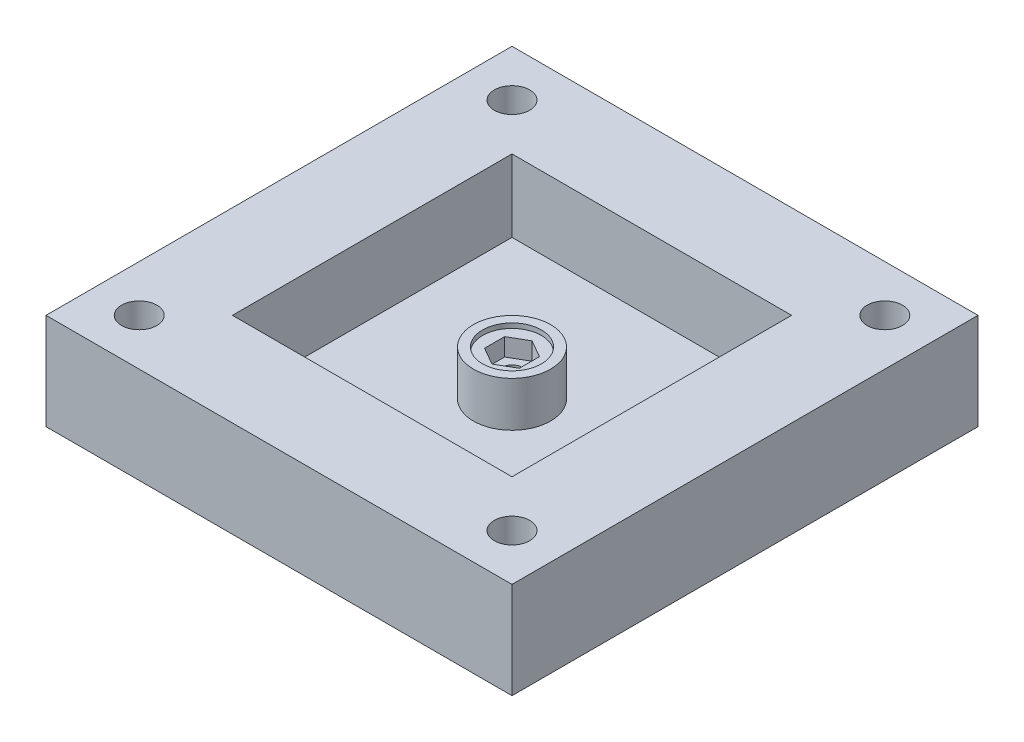
ISO-10303-21;
HEADER;
FILE_DESCRIPTION(('STEP AP214'),'2;1');
FILE_NAME('part.step','',(''),(''),'','','');
FILE_SCHEMA(('AUTOMOTIVE_DESIGN { 1 0 10303 214 1 1 1 1 }'));
ENDSEC;
DATA;
#1=APPLICATION_CONTEXT('core data for automotive mechanical design processes');
#2=APPLICATION_PROTOCOL_DEFINITION('international standard','automotive_design',2000,#1);
#3=PRODUCT_CONTEXT('',#1,'mechanical');
#4=PRODUCT('Part','Part','',(#3));
#5=PRODUCT_RELATED_PRODUCT_CATEGORY('part','',(#4));
#6=PRODUCT_DEFINITION_FORMATION('','',#4);
#7=PRODUCT_DEFINITION_CONTEXT('part definition',#1,'design');
#8=PRODUCT_DEFINITION('design','',#6,#7);
#9=PRODUCT_DEFINITION_SHAPE('','',#8);
#10=(LENGTH_UNIT() NAMED_UNIT(*) SI_UNIT(.MILLI.,.METRE.));
#11=(NAMED_UNIT(*) PLANE_ANGLE_UNIT() SI_UNIT($,.RADIAN.));
#12=(NAMED_UNIT(*) SI_UNIT($,.STERADIAN.) SOLID_ANGLE_UNIT());
#13=UNCERTAINTY_MEASURE_WITH_UNIT(LENGTH_MEASURE(1.E-05),#10,'distance_accuracy_value','');
#14=(GEOMETRIC_REPRESENTATION_CONTEXT(3) GLOBAL_UNCERTAINTY_ASSIGNED_CONTEXT((#13)) GLOBAL_UNIT_ASSIGNED_CONTEXT((#10,
#11,#12)) REPRESENTATION_CONTEXT('',''));
#15=CARTESIAN_POINT('',(0.,0.,0.));
#16=DIRECTION('',(0.,0.,1.));
#17=DIRECTION('',(1.,0.,0.));
#18=AXIS2_PLACEMENT_3D('',#15,#16,#17);
#19=CARTESIAN_POINT('',(5.4126587736527,14.5,-3.12500000000006));
#20=DIRECTION('',(0.499999999999995,0.,-0.866025403784441));
#21=DIRECTION('',(-0.866025403784442,0.,-0.499999999999995));
#22=AXIS2_PLACEMENT_3D('',#19,#20,#21);
#23=PLANE('',#22);
#24=DIRECTION('',(0.866025403784442,0.,0.499999999999995));
#25=VECTOR('',#24,1.);
#26=CARTESIAN_POINT('',(5.4126587736527,20.,-3.12500000000006));
#27=LINE('',#26,#25);
#28=CARTESIAN_POINT('',(0.,20.,-6.25));
#29=VERTEX_POINT('',#28);
#30=CARTESIAN_POINT('',(5.4126587736527,20.,-3.12500000000006));
#31=VERTEX_POINT('',#30);
#32=EDGE_CURVE('E145',#29,#31,#27,.T.);
#33=ORIENTED_EDGE('',*,*,#32,.F.);
#34=DIRECTION('',(0.,1.,0.));
#35=VECTOR('',#34,1.);
#36=CARTESIAN_POINT('',(0.,14.5,-6.25));
#37=LINE('',#36,#35);
#38=CARTESIAN_POINT('',(0.,14.5,-6.25));
#39=VERTEX_POINT('',#38);
#40=EDGE_CURVE('E153',#39,#29,#37,.T.);
#41=ORIENTED_EDGE('',*,*,#40,.F.);
#42=DIRECTION('',(-0.866025403784442,0.,-0.499999999999995));
#43=VECTOR('',#42,1.);
#44=CARTESIAN_POINT('',(5.4126587736527,14.5,-3.12500000000006));
#45=LINE('',#44,#43);
#46=CARTESIAN_POINT('',(5.4126587736527,14.5,-3.12500000000006));
#47=VERTEX_POINT('',#46);
#48=EDGE_CURVE('E524',#47,#39,#45,.T.);
#49=ORIENTED_EDGE('',*,*,#48,.F.);
#50=DIRECTION('',(0.,1.,0.));
#51=VECTOR('',#50,1.);
#52=CARTESIAN_POINT('',(5.4126587736527,14.5,-3.12500000000006));
#53=LINE('',#52,#51);
#54=EDGE_CURVE('E155',#47,#31,#53,.T.);
#55=ORIENTED_EDGE('',*,*,#54,.T.);
#56=EDGE_LOOP('',(#33,#41,#49,#55));
#57=FACE_BOUND('',#56,.T.);
#58=ADVANCED_FACE('F45',(#57),#23,.F.);
#59=CARTESIAN_POINT('',(5.41265877365277,14.5,3.12499999999995));
#60=DIRECTION('',(1.,0.,0.));
#61=DIRECTION('',(0.,0.,-1.));
#62=AXIS2_PLACEMENT_3D('',#59,#60,#61);
#63=PLANE('',#62);
#64=DIRECTION('',(0.,0.,1.));
#65=VECTOR('',#64,1.);
#66=CARTESIAN_POINT('',(5.41265877365277,20.,3.12499999999995));
#67=LINE('',#66,#65);
#68=CARTESIAN_POINT('',(5.41265877365277,20.,3.12499999999995));
#69=VERTEX_POINT('',#68);
#70=EDGE_CURVE('E158',#31,#69,#67,.T.);
#71=ORIENTED_EDGE('',*,*,#70,.F.);
#72=ORIENTED_EDGE('',*,*,#54,.F.);
#73=DIRECTION('',(0.,0.,-1.));
#74=VECTOR('',#73,1.);
#75=CARTESIAN_POINT('',(5.41265877365277,14.5,3.12499999999995));
#76=LINE('',#75,#74);
#77=CARTESIAN_POINT('',(5.41265877365277,14.5,3.12499999999995));
#78=VERTEX_POINT('',#77);
#79=EDGE_CURVE('E166',#78,#47,#76,.T.);
#80=ORIENTED_EDGE('',*,*,#79,.F.);
#81=DIRECTION('',(0.,1.,0.));
#82=VECTOR('',#81,1.);
#83=CARTESIAN_POINT('',(5.41265877365277,14.5,3.12499999999995));
#84=LINE('',#83,#82);
#85=EDGE_CURVE('E550',#78,#69,#84,.T.);
#86=ORIENTED_EDGE('',*,*,#85,.T.);
#87=EDGE_LOOP('',(#71,#72,#80,#86));
#88=FACE_BOUND('',#87,.T.);
#89=ADVANCED_FACE('F325',(#88),#63,.F.);
#90=CARTESIAN_POINT('',(0.,14.5,6.25));
#91=DIRECTION('',(0.500000000000007,0.,0.866025403784435));
#92=DIRECTION('',(0.866025403784435,0.,-0.500000000000007));
#93=AXIS2_PLACEMENT_3D('',#90,#91,#92);
#94=PLANE('',#93);
#95=DIRECTION('',(-0.866025403784435,0.,0.500000000000007));
#96=VECTOR('',#95,1.);
#97=CARTESIAN_POINT('',(0.,20.,6.25));
#98=LINE('',#97,#96);
#99=CARTESIAN_POINT('',(0.,20.,6.25));
#100=VERTEX_POINT('',#99);
#101=EDGE_CURVE('E568',#69,#100,#98,.T.);
#102=ORIENTED_EDGE('',*,*,#101,.F.);
#103=ORIENTED_EDGE('',*,*,#85,.F.);
#104=DIRECTION('',(0.866025403784435,0.,-0.500000000000007));
#105=VECTOR('',#104,1.);
#106=CARTESIAN_POINT('',(0.,14.5,6.25));
#107=LINE('',#106,#105);
#108=CARTESIAN_POINT('',(0.,14.5,6.25));
#109=VERTEX_POINT('',#108);
#110=EDGE_CURVE('E173',#109,#78,#107,.T.);
#111=ORIENTED_EDGE('',*,*,#110,.F.);
#112=DIRECTION('',(0.,1.,0.));
#113=VECTOR('',#112,1.);
#114=CARTESIAN_POINT('',(0.,14.5,6.25));
#115=LINE('',#114,#113);
#116=EDGE_CURVE('E554',#109,#100,#115,.T.);
#117=ORIENTED_EDGE('',*,*,#116,.T.);
#118=EDGE_LOOP('',(#102,#103,#111,#117));
#119=FACE_BOUND('',#118,.T.);
#120=ADVANCED_FACE('F331',(#119),#94,.F.);
#121=CARTESIAN_POINT('',(-5.41265877365273,14.5,3.12500000000002));
#122=DIRECTION('',(-0.499999999999995,0.,0.866025403784441));
#123=DIRECTION('',(0.866025403784442,0.,0.499999999999995));
#124=AXIS2_PLACEMENT_3D('',#121,#122,#123);
#125=PLANE('',#124);
#126=DIRECTION('',(-0.866025403784442,0.,-0.499999999999995));
#127=VECTOR('',#126,1.);
#128=CARTESIAN_POINT('',(-5.41265877365273,20.,3.12500000000002));
#129=LINE('',#128,#127);
#130=CARTESIAN_POINT('',(-5.41265877365273,20.,3.12500000000003));
#131=VERTEX_POINT('',#130);
#132=EDGE_CURVE('E561',#100,#131,#129,.T.);
#133=ORIENTED_EDGE('',*,*,#132,.F.);
#134=ORIENTED_EDGE('',*,*,#116,.F.);
#135=DIRECTION('',(0.866025403784441,0.,0.499999999999995));
#136=VECTOR('',#135,1.);
#137=CARTESIAN_POINT('',(-5.41265877365273,14.5,3.12500000000002));
#138=LINE('',#137,#136);
#139=CARTESIAN_POINT('',(-5.41265877365273,14.5,3.12500000000002));
#140=VERTEX_POINT('',#139);
#141=EDGE_CURVE('E542',#140,#109,#138,.T.);
#142=ORIENTED_EDGE('',*,*,#141,.F.);
#143=DIRECTION('',(0.,1.,0.));
#144=VECTOR('',#143,1.);
#145=CARTESIAN_POINT('',(-5.41265877365273,14.5,3.12500000000002));
#146=LINE('',#145,#144);
#147=EDGE_CURVE('E170',#140,#131,#146,.T.);
#148=ORIENTED_EDGE('',*,*,#147,.T.);
#149=EDGE_LOOP('',(#133,#134,#142,#148));
#150=FACE_BOUND('',#149,.T.);
#151=ADVANCED_FACE('F469',(#150),#125,.F.);
#152=CARTESIAN_POINT('',(-5.41265877365275,14.5,-3.12499999999999));
#153=DIRECTION('',(-1.,0.,0.));
#154=DIRECTION('',(0.,0.,1.));
#155=AXIS2_PLACEMENT_3D('',#152,#153,#154);
#156=PLANE('',#155);
#157=DIRECTION('',(0.,0.,-1.));
#158=VECTOR('',#157,1.);
#159=CARTESIAN_POINT('',(-5.41265877365275,20.,-3.12499999999999));
#160=LINE('',#159,#158);
#161=CARTESIAN_POINT('',(-5.41265877365275,20.,-3.12499999999999));
#162=VERTEX_POINT('',#161);
#163=EDGE_CURVE('E60',#131,#162,#160,.T.);
#164=ORIENTED_EDGE('',*,*,#163,.F.);
#165=ORIENTED_EDGE('',*,*,#147,.F.);
#166=DIRECTION('',(0.,0.,1.));
#167=VECTOR('',#166,1.);
#168=CARTESIAN_POINT('',(-5.41265877365275,14.5,-3.12499999999999));
#169=LINE('',#168,#167);
#170=CARTESIAN_POINT('',(-5.41265877365275,14.5,-3.12499999999999));
#171=VERTEX_POINT('',#170);
#172=EDGE_CURVE('E533',#171,#140,#169,.T.);
#173=ORIENTED_EDGE('',*,*,#172,.F.);
#174=DIRECTION('',(0.,1.,0.));
#175=VECTOR('',#174,1.);
#176=CARTESIAN_POINT('',(-5.41265877365275,14.5,-3.12499999999999));
#177=LINE('',#176,#175);
#178=EDGE_CURVE('E165',#171,#162,#177,.T.);
#179=ORIENTED_EDGE('',*,*,#178,.T.);
#180=EDGE_LOOP('',(#164,#165,#173,#179));
#181=FACE_BOUND('',#180,.T.);
#182=ADVANCED_FACE('F462',(#181),#156,.F.);
#183=CARTESIAN_POINT('',(0.,14.5,-6.25));
#184=DIRECTION('',(-0.500000000000001,0.,-0.866025403784438));
#185=DIRECTION('',(-0.866025403784438,0.,0.500000000000001));
#186=AXIS2_PLACEMENT_3D('',#183,#184,#185);
#187=PLANE('',#186);
#188=DIRECTION('',(0.866025403784438,0.,-0.500000000000001));
#189=VECTOR('',#188,1.);
#190=CARTESIAN_POINT('',(0.,20.,-6.25));
#191=LINE('',#190,#189);
#192=EDGE_CURVE('E11',#162,#29,#191,.T.);
#193=ORIENTED_EDGE('',*,*,#192,.F.);
#194=ORIENTED_EDGE('',*,*,#178,.F.);
#195=DIRECTION('',(-0.866025403784438,0.,0.500000000000001));
#196=VECTOR('',#195,1.);
#197=CARTESIAN_POINT('',(0.,14.5,-6.25));
#198=LINE('',#197,#196);
#199=EDGE_CURVE('E162',#39,#171,#198,.T.);
#200=ORIENTED_EDGE('',*,*,#199,.F.);
#201=ORIENTED_EDGE('',*,*,#40,.T.);
#202=EDGE_LOOP('',(#193,#194,#200,#201));
#203=FACE_BOUND('',#202,.T.);
#204=ADVANCED_FACE('F160',(#203),#187,.F.);
#205=CARTESIAN_POINT('',(72.5,30.,72.5));
#206=DIRECTION('',(-1.,0.,0.));
#207=DIRECTION('',(0.,0.,1.));
#208=AXIS2_PLACEMENT_3D('',#205,#206,#207);
#209=PLANE('',#208);
#210=DIRECTION('',(0.,0.,-1.));
#211=VECTOR('',#210,1.);
#212=CARTESIAN_POINT('',(72.5,0.,72.5));
#213=LINE('',#212,#211);
#214=CARTESIAN_POINT('',(72.5,0.,72.5));
#215=VERTEX_POINT('',#214);
#216=CARTESIAN_POINT('',(72.5,0.,-72.5));
#217=VERTEX_POINT('',#216);
#218=EDGE_CURVE('E215',#215,#217,#213,.T.);
#219=ORIENTED_EDGE('',*,*,#218,.T.);
#220=DIRECTION('',(0.,-1.,0.));
#221=VECTOR('',#220,1.);
#222=CARTESIAN_POINT('',(72.5,30.,-72.5));
#223=LINE('',#222,#221);
#224=CARTESIAN_POINT('',(72.5,30.,-72.5));
#225=VERTEX_POINT('',#224);
#226=EDGE_CURVE('E261',#225,#217,#223,.T.);
#227=ORIENTED_EDGE('',*,*,#226,.F.);
#228=DIRECTION('',(0.,0.,-1.));
#229=VECTOR('',#228,1.);
#230=CARTESIAN_POINT('',(72.5,30.,72.5));
#231=LINE('',#230,#229);
#232=CARTESIAN_POINT('',(72.5,30.,72.5));
#233=VERTEX_POINT('',#232);
#234=EDGE_CURVE('E224',#233,#225,#231,.T.);
#235=ORIENTED_EDGE('',*,*,#234,.F.);
#236=DIRECTION('',(0.,-1.,0.));
#237=VECTOR('',#236,1.);
#238=CARTESIAN_POINT('',(72.5,30.,72.5));
#239=LINE('',#238,#237);
#240=EDGE_CURVE('E238',#233,#215,#239,.T.);
#241=ORIENTED_EDGE('',*,*,#240,.T.);
#242=EDGE_LOOP('',(#219,#227,#235,#241));
#243=FACE_BOUND('',#242,.T.);
#244=ADVANCED_FACE('F47',(#243),#209,.F.);
#245=CARTESIAN_POINT('',(-72.5,30.,-72.5));
#246=DIRECTION('',(0.,0.,1.));
#247=DIRECTION('',(1.,0.,0.));
#248=AXIS2_PLACEMENT_3D('',#245,#246,#247);
#249=PLANE('',#248);
#250=DIRECTION('',(-1.,0.,0.));
#251=VECTOR('',#250,1.);
#252=CARTESIAN_POINT('',(-72.5,0.,-72.5));
#253=LINE('',#252,#251);
#254=CARTESIAN_POINT('',(-72.5,0.,-72.5));
#255=VERTEX_POINT('',#254);
#256=EDGE_CURVE('E242',#217,#255,#253,.T.);
#257=ORIENTED_EDGE('',*,*,#256,.T.);
#258=DIRECTION('',(0.,-1.,0.));
#259=VECTOR('',#258,1.);
#260=CARTESIAN_POINT('',(-72.5,30.,-72.5));
#261=LINE('',#260,#259);
#262=CARTESIAN_POINT('',(-72.5,30.,-72.5));
#263=VERTEX_POINT('',#262);
#264=EDGE_CURVE('E257',#263,#255,#261,.T.);
#265=ORIENTED_EDGE('',*,*,#264,.F.);
#266=DIRECTION('',(-1.,0.,0.));
#267=VECTOR('',#266,1.);
#268=CARTESIAN_POINT('',(-72.5,30.,-72.5));
#269=LINE('',#268,#267);
#270=EDGE_CURVE('E228',#225,#263,#269,.T.);
#271=ORIENTED_EDGE('',*,*,#270,.F.);
#272=ORIENTED_EDGE('',*,*,#226,.T.);
#273=EDGE_LOOP('',(#257,#265,#271,#272));
#274=FACE_BOUND('',#273,.T.);
#275=ADVANCED_FACE('F304',(#274),#249,.F.);
#276=CARTESIAN_POINT('',(-72.5,30.,72.5));
#277=DIRECTION('',(1.,0.,0.));
#278=DIRECTION('',(0.,0.,-1.));
#279=AXIS2_PLACEMENT_3D('',#276,#277,#278);
#280=PLANE('',#279);
#281=DIRECTION('',(0.,0.,1.));
#282=VECTOR('',#281,1.);
#283=CARTESIAN_POINT('',(-72.5,0.,72.5));
#284=LINE('',#283,#282);
#285=CARTESIAN_POINT('',(-72.5,0.,72.5));
#286=VERTEX_POINT('',#285);
#287=EDGE_CURVE('E245',#255,#286,#284,.T.);
#288=ORIENTED_EDGE('',*,*,#287,.T.);
#289=DIRECTION('',(0.,-1.,0.));
#290=VECTOR('',#289,1.);
#291=CARTESIAN_POINT('',(-72.5,30.,72.5));
#292=LINE('',#291,#290);
#293=CARTESIAN_POINT('',(-72.5,30.,72.5));
#294=VERTEX_POINT('',#293);
#295=EDGE_CURVE('E253',#294,#286,#292,.T.);
#296=ORIENTED_EDGE('',*,*,#295,.F.);
#297=DIRECTION('',(0.,0.,1.));
#298=VECTOR('',#297,1.);
#299=CARTESIAN_POINT('',(-72.5,30.,72.5));
#300=LINE('',#299,#298);
#301=EDGE_CURVE('E232',#263,#294,#300,.T.);
#302=ORIENTED_EDGE('',*,*,#301,.F.);
#303=ORIENTED_EDGE('',*,*,#264,.T.);
#304=EDGE_LOOP('',(#288,#296,#302,#303));
#305=FACE_BOUND('',#304,.T.);
#306=ADVANCED_FACE('F309',(#305),#280,.F.);
#307=CARTESIAN_POINT('',(-72.5,30.,72.5));
#308=DIRECTION('',(0.,0.,-1.));
#309=DIRECTION('',(-1.,0.,0.));
#310=AXIS2_PLACEMENT_3D('',#307,#308,#309);
#311=PLANE('',#310);
#312=DIRECTION('',(1.,0.,0.));
#313=VECTOR('',#312,1.);
#314=CARTESIAN_POINT('',(-72.5,0.,72.5));
#315=LINE('',#314,#313);
#316=EDGE_CURVE('E229',#286,#215,#315,.T.);
#317=ORIENTED_EDGE('',*,*,#316,.T.);
#318=ORIENTED_EDGE('',*,*,#240,.F.);
#319=DIRECTION('',(1.,0.,0.));
#320=VECTOR('',#319,1.);
#321=CARTESIAN_POINT('',(-72.5,30.,72.5));
#322=LINE('',#321,#320);
#323=EDGE_CURVE('E235',#294,#233,#322,.T.);
#324=ORIENTED_EDGE('',*,*,#323,.F.);
#325=ORIENTED_EDGE('',*,*,#295,.T.);
#326=EDGE_LOOP('',(#317,#318,#324,#325));
#327=FACE_BOUND('',#326,.T.);
#328=ADVANCED_FACE('F293',(#327),#311,.F.);
#329=CARTESIAN_POINT('',(0.,30.,0.));
#330=DIRECTION('',(0.,-1.,0.));
#331=DIRECTION('',(0.,0.,-1.));
#332=AXIS2_PLACEMENT_3D('',#329,#330,#331);
#333=PLANE('',#332);
#334=CARTESIAN_POINT('',(-58.,30.,58.));
#335=DIRECTION('',(0.,1.,0.));
#336=DIRECTION('',(0.,0.,-1.));
#337=AXIS2_PLACEMENT_3D('',#334,#335,#336);
#338=CIRCLE('',#337,5.5);
#339=CARTESIAN_POINT('',(-58.,30.,52.5));
#340=VERTEX_POINT('',#339);
#341=EDGE_CURVE('E600',#340,#340,#338,.T.);
#342=ORIENTED_EDGE('',*,*,#341,.F.);
#343=EDGE_LOOP('',(#342));
#344=FACE_BOUND('',#343,.T.);
#345=CARTESIAN_POINT('',(58.,30.,58.));
#346=DIRECTION('',(0.,1.,0.));
#347=DIRECTION('',(0.,0.,1.));
#348=AXIS2_PLACEMENT_3D('',#345,#346,#347);
#349=CIRCLE('',#348,5.5);
#350=CARTESIAN_POINT('',(58.,30.,63.4999999999999));
#351=VERTEX_POINT('',#350);
#352=EDGE_CURVE('E592',#351,#351,#349,.T.);
#353=ORIENTED_EDGE('',*,*,#352,.F.);
#354=EDGE_LOOP('',(#353));
#355=FACE_BOUND('',#354,.T.);
#356=CARTESIAN_POINT('',(58.,30.,-58.));
#357=DIRECTION('',(0.,1.,0.));
#358=DIRECTION('',(0.,0.,-1.));
#359=AXIS2_PLACEMENT_3D('',#356,#357,#358);
#360=CIRCLE('',#359,5.5);
#361=CARTESIAN_POINT('',(58.,30.,-63.4999999999999));
#362=VERTEX_POINT('',#361);
#363=EDGE_CURVE('E584',#362,#362,#360,.T.);
#364=ORIENTED_EDGE('',*,*,#363,.F.);
#365=EDGE_LOOP('',(#364));
#366=FACE_BOUND('',#365,.T.);
#367=CARTESIAN_POINT('',(-58.,30.,-58.));
#368=DIRECTION('',(0.,1.,0.));
#369=DIRECTION('',(0.,0.,1.));
#370=AXIS2_PLACEMENT_3D('',#367,#368,#369);
#371=CIRCLE('',#370,5.5);
#372=CARTESIAN_POINT('',(-58.,30.,-52.5));
#373=VERTEX_POINT('',#372);
#374=EDGE_CURVE('E536',#373,#373,#371,.T.);
#375=ORIENTED_EDGE('',*,*,#374,.F.);
#376=EDGE_LOOP('',(#375));
#377=FACE_BOUND('',#376,.T.);
#378=DIRECTION('',(-1.,0.,0.));
#379=VECTOR('',#378,1.);
#380=CARTESIAN_POINT('',(-43.5,30.,-43.5));
#381=LINE('',#380,#379);
#382=CARTESIAN_POINT('',(43.5,30.,-43.5));
#383=VERTEX_POINT('',#382);
#384=CARTESIAN_POINT('',(-43.5,30.,-43.5));
#385=VERTEX_POINT('',#384);
#386=EDGE_CURVE('E201',#383,#385,#381,.T.);
#387=ORIENTED_EDGE('',*,*,#386,.F.);
#388=DIRECTION('',(0.,0.,-1.));
#389=VECTOR('',#388,1.);
#390=CARTESIAN_POINT('',(43.5,30.,43.5));
#391=LINE('',#390,#389);
#392=CARTESIAN_POINT('',(43.5,30.,43.5));
#393=VERTEX_POINT('',#392);
#394=EDGE_CURVE('E68',#393,#383,#391,.T.);
#395=ORIENTED_EDGE('',*,*,#394,.F.);
#396=DIRECTION('',(1.,0.,0.));
#397=VECTOR('',#396,1.);
#398=CARTESIAN_POINT('',(-43.5,30.,43.5));
#399=LINE('',#398,#397);
#400=CARTESIAN_POINT('',(-43.5,30.,43.5));
#401=VERTEX_POINT('',#400);
#402=EDGE_CURVE('E186',#401,#393,#399,.T.);
#403=ORIENTED_EDGE('',*,*,#402,.F.);
#404=DIRECTION('',(0.,0.,1.));
#405=VECTOR('',#404,1.);
#406=CARTESIAN_POINT('',(-43.5,30.,43.5));
#407=LINE('',#406,#405);
#408=EDGE_CURVE('E205',#385,#401,#407,.T.);
#409=ORIENTED_EDGE('',*,*,#408,.F.);
#410=EDGE_LOOP('',(#387,#395,#403,#409));
#411=FACE_BOUND('',#410,.T.);
#412=ORIENTED_EDGE('',*,*,#234,.T.);
#413=ORIENTED_EDGE('',*,*,#270,.T.);
#414=ORIENTED_EDGE('',*,*,#301,.T.);
#415=ORIENTED_EDGE('',*,*,#323,.T.);
#416=EDGE_LOOP('',(#412,#413,#414,#415));
#417=FACE_BOUND('',#416,.T.);
#418=ADVANCED_FACE('F289',(#344,#355,#366,#377,#411,#417),#333,.F.);
#419=CARTESIAN_POINT('',(0.,0.,0.));
#420=DIRECTION('',(0.,-1.,0.));
#421=DIRECTION('',(0.,0.,-1.));
#422=AXIS2_PLACEMENT_3D('',#419,#420,#421);
#423=PLANE('',#422);
#424=CARTESIAN_POINT('',(0.,0.,0.));
#425=DIRECTION('',(0.,-1.,0.));
#426=DIRECTION('',(0.,0.,-1.));
#427=AXIS2_PLACEMENT_3D('',#424,#425,#426);
#428=CIRCLE('',#427,3.05);
#429=CARTESIAN_POINT('',(0.,0.,-3.05));
#430=VERTEX_POINT('',#429);
#431=EDGE_CURVE('E157',#430,#430,#428,.F.);
#432=ORIENTED_EDGE('',*,*,#431,.T.);
#433=EDGE_LOOP('',(#432));
#434=FACE_BOUND('',#433,.T.);
#435=ORIENTED_EDGE('',*,*,#218,.F.);
#436=ORIENTED_EDGE('',*,*,#316,.F.);
#437=ORIENTED_EDGE('',*,*,#287,.F.);
#438=ORIENTED_EDGE('',*,*,#256,.F.);
#439=EDGE_LOOP('',(#435,#436,#437,#438));
#440=FACE_BOUND('',#439,.T.);
#441=ADVANCED_FACE('F292',(#434,#440),#423,.T.);
#442=CARTESIAN_POINT('',(43.5,7.5,43.5));
#443=DIRECTION('',(1.,0.,0.));
#444=DIRECTION('',(0.,0.,-1.));
#445=AXIS2_PLACEMENT_3D('',#442,#443,#444);
#446=PLANE('',#445);
#447=ORIENTED_EDGE('',*,*,#394,.T.);
#448=DIRECTION('',(0.,1.,0.));
#449=VECTOR('',#448,1.);
#450=CARTESIAN_POINT('',(43.5,7.5,-43.5));
#451=LINE('',#450,#449);
#452=CARTESIAN_POINT('',(43.5,7.5,-43.5));
#453=VERTEX_POINT('',#452);
#454=EDGE_CURVE('E198',#453,#383,#451,.T.);
#455=ORIENTED_EDGE('',*,*,#454,.F.);
#456=DIRECTION('',(0.,0.,-1.));
#457=VECTOR('',#456,1.);
#458=CARTESIAN_POINT('',(43.5,7.5,43.5));
#459=LINE('',#458,#457);
#460=CARTESIAN_POINT('',(43.5,7.5,43.5));
#461=VERTEX_POINT('',#460);
#462=EDGE_CURVE('E181',#461,#453,#459,.T.);
#463=ORIENTED_EDGE('',*,*,#462,.F.);
#464=DIRECTION('',(0.,1.,0.));
#465=VECTOR('',#464,1.);
#466=CARTESIAN_POINT('',(43.5,7.5,43.5));
#467=LINE('',#466,#465);
#468=EDGE_CURVE('E212',#461,#393,#467,.T.);
#469=ORIENTED_EDGE('',*,*,#468,.T.);
#470=EDGE_LOOP('',(#447,#455,#463,#469));
#471=FACE_BOUND('',#470,.T.);
#472=ADVANCED_FACE('F278',(#471),#446,.F.);
#473=CARTESIAN_POINT('',(-43.5,7.5,43.5));
#474=DIRECTION('',(0.,0.,1.));
#475=DIRECTION('',(1.,0.,0.));
#476=AXIS2_PLACEMENT_3D('',#473,#474,#475);
#477=PLANE('',#476);
#478=ORIENTED_EDGE('',*,*,#402,.T.);
#479=ORIENTED_EDGE('',*,*,#468,.F.);
#480=DIRECTION('',(1.,0.,0.));
#481=VECTOR('',#480,1.);
#482=CARTESIAN_POINT('',(-43.5,7.5,43.5));
#483=LINE('',#482,#481);
#484=CARTESIAN_POINT('',(-43.5,7.5,43.5));
#485=VERTEX_POINT('',#484);
#486=EDGE_CURVE('E194',#485,#461,#483,.T.);
#487=ORIENTED_EDGE('',*,*,#486,.F.);
#488=DIRECTION('',(0.,1.,0.));
#489=VECTOR('',#488,1.);
#490=CARTESIAN_POINT('',(-43.5,7.5,43.5));
#491=LINE('',#490,#489);
#492=EDGE_CURVE('E216',#485,#401,#491,.T.);
#493=ORIENTED_EDGE('',*,*,#492,.T.);
#494=EDGE_LOOP('',(#478,#479,#487,#493));
#495=FACE_BOUND('',#494,.T.);
#496=ADVANCED_FACE('F286',(#495),#477,.F.);
#497=CARTESIAN_POINT('',(-43.5,7.5,43.5));
#498=DIRECTION('',(-1.,0.,0.));
#499=DIRECTION('',(0.,0.,1.));
#500=AXIS2_PLACEMENT_3D('',#497,#498,#499);
#501=PLANE('',#500);
#502=ORIENTED_EDGE('',*,*,#408,.T.);
#503=ORIENTED_EDGE('',*,*,#492,.F.);
#504=DIRECTION('',(0.,0.,1.));
#505=VECTOR('',#504,1.);
#506=CARTESIAN_POINT('',(-43.5,7.5,43.5));
#507=LINE('',#506,#505);
#508=CARTESIAN_POINT('',(-43.5,7.5,-43.5));
#509=VERTEX_POINT('',#508);
#510=EDGE_CURVE('E190',#509,#485,#507,.T.);
#511=ORIENTED_EDGE('',*,*,#510,.F.);
#512=DIRECTION('',(0.,1.,0.));
#513=VECTOR('',#512,1.);
#514=CARTESIAN_POINT('',(-43.5,7.5,-43.5));
#515=LINE('',#514,#513);
#516=EDGE_CURVE('E219',#509,#385,#515,.T.);
#517=ORIENTED_EDGE('',*,*,#516,.T.);
#518=EDGE_LOOP('',(#502,#503,#511,#517));
#519=FACE_BOUND('',#518,.T.);
#520=ADVANCED_FACE('F284',(#519),#501,.F.);
#521=CARTESIAN_POINT('',(-43.5,7.5,-43.5));
#522=DIRECTION('',(0.,0.,-1.));
#523=DIRECTION('',(-1.,0.,0.));
#524=AXIS2_PLACEMENT_3D('',#521,#522,#523);
#525=PLANE('',#524);
#526=ORIENTED_EDGE('',*,*,#386,.T.);
#527=ORIENTED_EDGE('',*,*,#516,.F.);
#528=DIRECTION('',(-1.,0.,0.));
#529=VECTOR('',#528,1.);
#530=CARTESIAN_POINT('',(-43.5,7.5,-43.5));
#531=LINE('',#530,#529);
#532=EDGE_CURVE('E185',#453,#509,#531,.T.);
#533=ORIENTED_EDGE('',*,*,#532,.F.);
#534=ORIENTED_EDGE('',*,*,#454,.T.);
#535=EDGE_LOOP('',(#526,#527,#533,#534));
#536=FACE_BOUND('',#535,.T.);
#537=ADVANCED_FACE('F273',(#536),#525,.F.);
#538=CARTESIAN_POINT('',(0.,7.5,0.));
#539=DIRECTION('',(0.,-1.,0.));
#540=DIRECTION('',(0.,0.,-1.));
#541=AXIS2_PLACEMENT_3D('',#538,#539,#540);
#542=PLANE('',#541);
#543=CARTESIAN_POINT('',(0.,7.5,0.));
#544=DIRECTION('',(0.,-1.,0.));
#545=DIRECTION('',(0.,0.,-1.));
#546=AXIS2_PLACEMENT_3D('',#543,#544,#545);
#547=CIRCLE('',#546,12.);
#548=CARTESIAN_POINT('',(0.,7.5,-12.));
#549=VERTEX_POINT('',#548);
#550=EDGE_CURVE('E54',#549,#549,#547,.F.);
#551=ORIENTED_EDGE('',*,*,#550,.F.);
#552=EDGE_LOOP('',(#551));
#553=FACE_BOUND('',#552,.T.);
#554=ORIENTED_EDGE('',*,*,#462,.T.);
#555=ORIENTED_EDGE('',*,*,#532,.T.);
#556=ORIENTED_EDGE('',*,*,#510,.T.);
#557=ORIENTED_EDGE('',*,*,#486,.T.);
#558=EDGE_LOOP('',(#554,#555,#556,#557));
#559=FACE_BOUND('',#558,.T.);
#560=ADVANCED_FACE('F270',(#553,#559),#542,.F.);
#561=CARTESIAN_POINT('',(0.,21.5,0.));
#562=DIRECTION('',(0.,-1.,0.));
#563=DIRECTION('',(0.,0.,-1.));
#564=AXIS2_PLACEMENT_3D('',#561,#562,#563);
#565=CYLINDRICAL_SURFACE('',#564,12.);
#566=CARTESIAN_POINT('',(0.,21.5,0.));
#567=DIRECTION('',(0.,1.,0.));
#568=DIRECTION('',(0.,0.,1.));
#569=AXIS2_PLACEMENT_3D('',#566,#567,#568);
#570=CIRCLE('',#569,12.);
#571=CARTESIAN_POINT('',(0.,21.5,12.));
#572=VERTEX_POINT('',#571);
#573=EDGE_CURVE('E177',#572,#572,#570,.T.);
#574=ORIENTED_EDGE('',*,*,#573,.F.);
#575=EDGE_LOOP('',(#574));
#576=FACE_BOUND('',#575,.T.);
#577=ORIENTED_EDGE('',*,*,#550,.T.);
#578=EDGE_LOOP('',(#577));
#579=FACE_BOUND('',#578,.T.);
#580=ADVANCED_FACE('F268',(#576,#579),#565,.T.);
#581=CARTESIAN_POINT('',(0.,21.5,0.));
#582=DIRECTION('',(0.,1.,0.));
#583=DIRECTION('',(0.,0.,1.));
#584=AXIS2_PLACEMENT_3D('',#581,#582,#583);
#585=PLANE('',#584);
#586=CARTESIAN_POINT('',(0.,21.5,0.));
#587=DIRECTION('',(0.,1.,0.));
#588=DIRECTION('',(0.,0.,1.));
#589=AXIS2_PLACEMENT_3D('',#586,#587,#588);
#590=CIRCLE('',#589,9.15);
#591=CARTESIAN_POINT('',(0.,21.5,9.15));
#592=VERTEX_POINT('',#591);
#593=EDGE_CURVE('E571',#592,#592,#590,.T.);
#594=ORIENTED_EDGE('',*,*,#593,.F.);
#595=EDGE_LOOP('',(#594));
#596=FACE_BOUND('',#595,.T.);
#597=ORIENTED_EDGE('',*,*,#573,.T.);
#598=EDGE_LOOP('',(#597));
#599=FACE_BOUND('',#598,.T.);
#600=ADVANCED_FACE('F337',(#596,#599),#585,.T.);
#601=CARTESIAN_POINT('',(0.,14.5,0.));
#602=DIRECTION('',(0.,1.,0.));
#603=DIRECTION('',(0.,0.,1.));
#604=AXIS2_PLACEMENT_3D('',#601,#602,#603);
#605=PLANE('',#604);
#606=CARTESIAN_POINT('',(0.,14.5,0.));
#607=DIRECTION('',(0.,1.,0.));
#608=DIRECTION('',(0.,0.,1.));
#609=AXIS2_PLACEMENT_3D('',#606,#607,#608);
#610=CIRCLE('',#609,3.05);
#611=CARTESIAN_POINT('',(0.,14.5,3.05));
#612=VERTEX_POINT('',#611);
#613=EDGE_CURVE('E523',#612,#612,#610,.T.);
#614=ORIENTED_EDGE('',*,*,#613,.F.);
#615=EDGE_LOOP('',(#614));
#616=FACE_BOUND('',#615,.T.);
#617=ORIENTED_EDGE('',*,*,#48,.T.);
#618=ORIENTED_EDGE('',*,*,#199,.T.);
#619=ORIENTED_EDGE('',*,*,#172,.T.);
#620=ORIENTED_EDGE('',*,*,#141,.T.);
#621=ORIENTED_EDGE('',*,*,#110,.T.);
#622=ORIENTED_EDGE('',*,*,#79,.T.);
#623=EDGE_LOOP('',(#617,#618,#619,#620,#621,#622));
#624=FACE_BOUND('',#623,.T.);
#625=ADVANCED_FACE('F340',(#616,#624),#605,.T.);
#626=CARTESIAN_POINT('',(-58.,15.,-58.));
#627=DIRECTION('',(0.,1.,0.));
#628=DIRECTION('',(0.,0.,1.));
#629=AXIS2_PLACEMENT_3D('',#626,#627,#628);
#630=CYLINDRICAL_SURFACE('',#629,5.5);
#631=CARTESIAN_POINT('',(-58.,15.,-58.));
#632=DIRECTION('',(0.,1.,0.));
#633=DIRECTION('',(0.,0.,1.));
#634=AXIS2_PLACEMENT_3D('',#631,#632,#633);
#635=CIRCLE('',#634,5.5);
#636=CARTESIAN_POINT('',(-58.,15.,-52.5));
#637=VERTEX_POINT('',#636);
#638=EDGE_CURVE('E529',#637,#637,#635,.T.);
#639=ORIENTED_EDGE('',*,*,#638,.F.);
#640=EDGE_LOOP('',(#639));
#641=FACE_BOUND('',#640,.T.);
#642=ORIENTED_EDGE('',*,*,#374,.T.);
#643=EDGE_LOOP('',(#642));
#644=FACE_BOUND('',#643,.T.);
#645=ADVANCED_FACE('F375',(#641,#644),#630,.F.);
#646=CARTESIAN_POINT('',(-58.,15.,-58.));
#647=DIRECTION('',(0.,1.,0.));
#648=DIRECTION('',(0.,0.,1.));
#649=AXIS2_PLACEMENT_3D('',#646,#647,#648);
#650=PLANE('',#649);
#651=ORIENTED_EDGE('',*,*,#638,.T.);
#652=EDGE_LOOP('',(#651));
#653=FACE_BOUND('',#652,.T.);
#654=ADVANCED_FACE('F379',(#653),#650,.T.);
#655=CARTESIAN_POINT('',(58.,15.,-58.));
#656=DIRECTION('',(0.,1.,0.));
#657=DIRECTION('',(0.,0.,1.));
#658=AXIS2_PLACEMENT_3D('',#655,#656,#657);
#659=CYLINDRICAL_SURFACE('',#658,5.5);
#660=CARTESIAN_POINT('',(58.,15.,-58.));
#661=DIRECTION('',(0.,1.,0.));
#662=DIRECTION('',(0.,0.,-1.));
#663=AXIS2_PLACEMENT_3D('',#660,#661,#662);
#664=CIRCLE('',#663,5.5);
#665=CARTESIAN_POINT('',(58.,15.,-63.4999999999999));
#666=VERTEX_POINT('',#665);
#667=EDGE_CURVE('E588',#666,#666,#664,.T.);
#668=ORIENTED_EDGE('',*,*,#667,.F.);
#669=EDGE_LOOP('',(#668));
#670=FACE_BOUND('',#669,.T.);
#671=ORIENTED_EDGE('',*,*,#363,.T.);
#672=EDGE_LOOP('',(#671));
#673=FACE_BOUND('',#672,.T.);
#674=ADVANCED_FACE('F389',(#670,#673),#659,.F.);
#675=CARTESIAN_POINT('',(58.,15.,-58.));
#676=DIRECTION('',(0.,-1.,0.));
#677=DIRECTION('',(0.,0.,-1.));
#678=AXIS2_PLACEMENT_3D('',#675,#676,#677);
#679=PLANE('',#678);
#680=ORIENTED_EDGE('',*,*,#667,.T.);
#681=EDGE_LOOP('',(#680));
#682=FACE_BOUND('',#681,.T.);
#683=ADVANCED_FACE('F398',(#682),#679,.F.);
#684=CARTESIAN_POINT('',(58.,15.,58.));
#685=DIRECTION('',(0.,1.,0.));
#686=DIRECTION('',(0.,0.,1.));
#687=AXIS2_PLACEMENT_3D('',#684,#685,#686);
#688=CYLINDRICAL_SURFACE('',#687,5.5);
#689=CARTESIAN_POINT('',(58.,15.,58.));
#690=DIRECTION('',(0.,1.,0.));
#691=DIRECTION('',(0.,0.,1.));
#692=AXIS2_PLACEMENT_3D('',#689,#690,#691);
#693=CIRCLE('',#692,5.5);
#694=CARTESIAN_POINT('',(58.,15.,63.4999999999999));
#695=VERTEX_POINT('',#694);
#696=EDGE_CURVE('E596',#695,#695,#693,.T.);
#697=ORIENTED_EDGE('',*,*,#696,.F.);
#698=EDGE_LOOP('',(#697));
#699=FACE_BOUND('',#698,.T.);
#700=ORIENTED_EDGE('',*,*,#352,.T.);
#701=EDGE_LOOP('',(#700));
#702=FACE_BOUND('',#701,.T.);
#703=ADVANCED_FACE('F407',(#699,#702),#688,.F.);
#704=CARTESIAN_POINT('',(58.,15.,58.));
#705=DIRECTION('',(0.,1.,0.));
#706=DIRECTION('',(0.,0.,1.));
#707=AXIS2_PLACEMENT_3D('',#704,#705,#706);
#708=PLANE('',#707);
#709=ORIENTED_EDGE('',*,*,#696,.T.);
#710=EDGE_LOOP('',(#709));
#711=FACE_BOUND('',#710,.T.);
#712=ADVANCED_FACE('F416',(#711),#708,.T.);
#713=CARTESIAN_POINT('',(-58.,15.,58.));
#714=DIRECTION('',(0.,1.,0.));
#715=DIRECTION('',(0.,0.,1.));
#716=AXIS2_PLACEMENT_3D('',#713,#714,#715);
#717=CYLINDRICAL_SURFACE('',#716,5.5);
#718=CARTESIAN_POINT('',(-58.,15.,58.));
#719=DIRECTION('',(0.,1.,0.));
#720=DIRECTION('',(0.,0.,-1.));
#721=AXIS2_PLACEMENT_3D('',#718,#719,#720);
#722=CIRCLE('',#721,5.5);
#723=CARTESIAN_POINT('',(-58.,15.,52.5));
#724=VERTEX_POINT('',#723);
#725=EDGE_CURVE('E581',#724,#724,#722,.T.);
#726=ORIENTED_EDGE('',*,*,#725,.F.);
#727=EDGE_LOOP('',(#726));
#728=FACE_BOUND('',#727,.T.);
#729=ORIENTED_EDGE('',*,*,#341,.T.);
#730=EDGE_LOOP('',(#729));
#731=FACE_BOUND('',#730,.T.);
#732=ADVANCED_FACE('F425',(#728,#731),#717,.F.);
#733=CARTESIAN_POINT('',(-58.,15.,58.));
#734=DIRECTION('',(0.,-1.,0.));
#735=DIRECTION('',(0.,0.,-1.));
#736=AXIS2_PLACEMENT_3D('',#733,#734,#735);
#737=PLANE('',#736);
#738=ORIENTED_EDGE('',*,*,#725,.T.);
#739=EDGE_LOOP('',(#738));
#740=FACE_BOUND('',#739,.T.);
#741=ADVANCED_FACE('F433',(#740),#737,.F.);
#742=CARTESIAN_POINT('',(0.,-0.000999999999999265,0.));
#743=DIRECTION('',(0.,1.,0.));
#744=DIRECTION('',(0.,0.,1.));
#745=AXIS2_PLACEMENT_3D('',#742,#743,#744);
#746=CYLINDRICAL_SURFACE('',#745,3.05);
#747=ORIENTED_EDGE('',*,*,#431,.F.);
#748=EDGE_LOOP('',(#747));
#749=FACE_BOUND('',#748,.T.);
#750=ORIENTED_EDGE('',*,*,#613,.T.);
#751=EDGE_LOOP('',(#750));
#752=FACE_BOUND('',#751,.T.);
#753=ADVANCED_FACE('F441',(#749,#752),#746,.F.);
#754=CARTESIAN_POINT('',(0.,20.,0.));
#755=DIRECTION('',(0.,1.,0.));
#756=DIRECTION('',(0.,0.,1.));
#757=AXIS2_PLACEMENT_3D('',#754,#755,#756);
#758=PLANE('',#757);
#759=CARTESIAN_POINT('',(0.,20.,0.));
#760=DIRECTION('',(0.,1.,0.));
#761=DIRECTION('',(0.,0.,1.));
#762=AXIS2_PLACEMENT_3D('',#759,#760,#761);
#763=CIRCLE('',#762,9.15);
#764=CARTESIAN_POINT('',(0.,20.,9.15));
#765=VERTEX_POINT('',#764);
#766=EDGE_CURVE('E564',#765,#765,#763,.T.);
#767=ORIENTED_EDGE('',*,*,#766,.T.);
#768=EDGE_LOOP('',(#767));
#769=FACE_BOUND('',#768,.T.);
#770=ORIENTED_EDGE('',*,*,#32,.T.);
#771=ORIENTED_EDGE('',*,*,#70,.T.);
#772=ORIENTED_EDGE('',*,*,#101,.T.);
#773=ORIENTED_EDGE('',*,*,#132,.T.);
#774=ORIENTED_EDGE('',*,*,#163,.T.);
#775=ORIENTED_EDGE('',*,*,#192,.T.);
#776=EDGE_LOOP('',(#770,#771,#772,#773,#774,#775));
#777=FACE_BOUND('',#776,.T.);
#778=ADVANCED_FACE('F144',(#769,#777),#758,.T.);
#779=CARTESIAN_POINT('',(0.,20.,0.));
#780=DIRECTION('',(0.,1.,0.));
#781=DIRECTION('',(0.,0.,1.));
#782=AXIS2_PLACEMENT_3D('',#779,#780,#781);
#783=CYLINDRICAL_SURFACE('',#782,9.15);
#784=ORIENTED_EDGE('',*,*,#766,.F.);
#785=EDGE_LOOP('',(#784));
#786=FACE_BOUND('',#785,.T.);
#787=ORIENTED_EDGE('',*,*,#593,.T.);
#788=EDGE_LOOP('',(#787));
#789=FACE_BOUND('',#788,.T.);
#790=ADVANCED_FACE('F502',(#786,#789),#783,.F.);
#791=CLOSED_SHELL('',(#58,#89,#120,#151,#182,#204,#244,#275,#306,#328,#418,#441,#472,#496,#520,
#537,#560,#580,#600,#625,#645,#654,#674,#683,#703,#712,#732,#741,#753,#778,#790));
#792=MANIFOLD_SOLID_BREP('B2',#791);
#793=ADVANCED_BREP_SHAPE_REPRESENTATION('',(#18,#792),#14);
#794=SHAPE_DEFINITION_REPRESENTATION(#9,#793);
ENDSEC;
END-ISO-10303-21;
